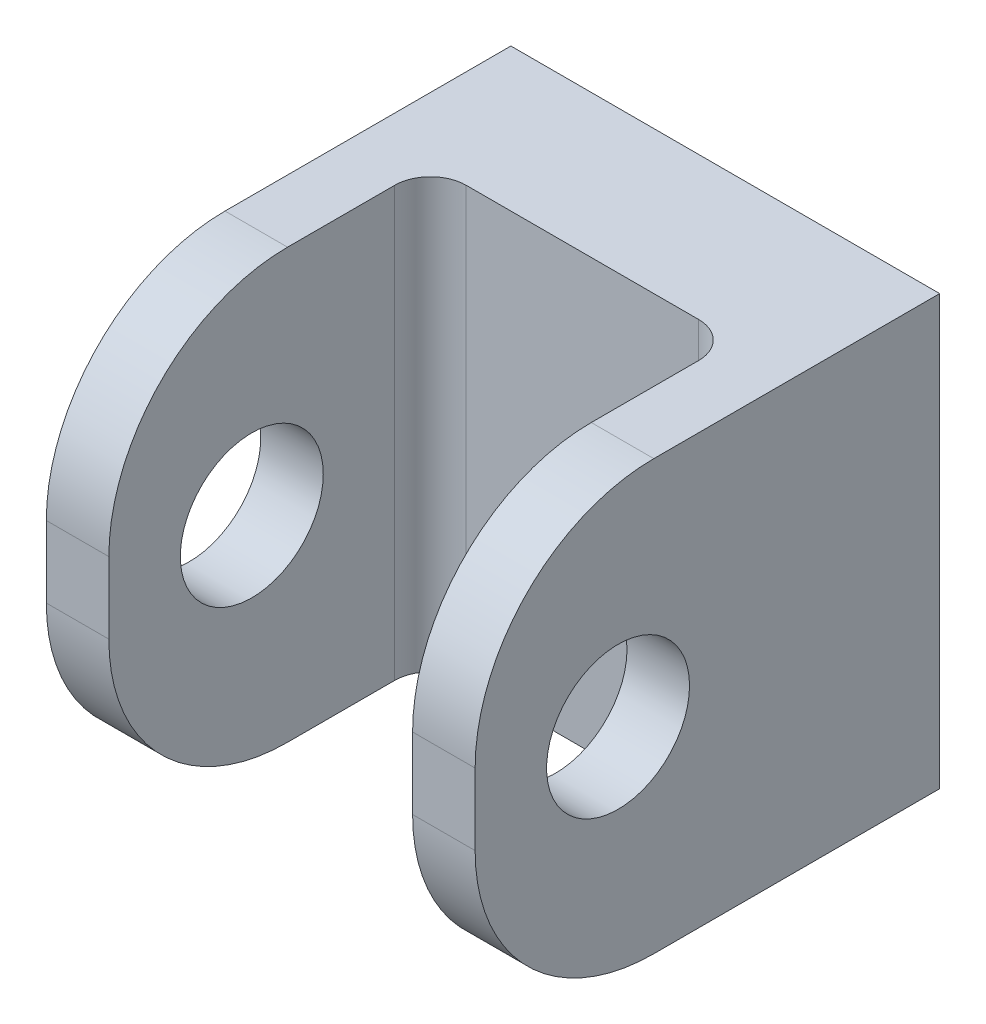
ISO-10303-21;
HEADER;
FILE_DESCRIPTION(('STEP AP214'),'2;1');
FILE_NAME('part.step','',(''),(''),'','','');
FILE_SCHEMA(('AUTOMOTIVE_DESIGN { 1 0 10303 214 1 1 1 1 }'));
ENDSEC;
DATA;
#1=APPLICATION_CONTEXT('core data for automotive mechanical design processes');
#2=APPLICATION_PROTOCOL_DEFINITION('international standard','automotive_design',2000,#1);
#3=PRODUCT_CONTEXT('',#1,'mechanical');
#4=PRODUCT('Part','Part','',(#3));
#5=PRODUCT_RELATED_PRODUCT_CATEGORY('part','',(#4));
#6=PRODUCT_DEFINITION_FORMATION('','',#4);
#7=PRODUCT_DEFINITION_CONTEXT('part definition',#1,'design');
#8=PRODUCT_DEFINITION('design','',#6,#7);
#9=PRODUCT_DEFINITION_SHAPE('','',#8);
#10=(LENGTH_UNIT() NAMED_UNIT(*) SI_UNIT(.MILLI.,.METRE.));
#11=(NAMED_UNIT(*) PLANE_ANGLE_UNIT() SI_UNIT($,.RADIAN.));
#12=(NAMED_UNIT(*) SI_UNIT($,.STERADIAN.) SOLID_ANGLE_UNIT());
#13=UNCERTAINTY_MEASURE_WITH_UNIT(LENGTH_MEASURE(1.E-05),#10,'distance_accuracy_value','');
#14=(GEOMETRIC_REPRESENTATION_CONTEXT(3) GLOBAL_UNCERTAINTY_ASSIGNED_CONTEXT((#13)) GLOBAL_UNIT_ASSIGNED_CONTEXT((#10,
#11,#12)) REPRESENTATION_CONTEXT('',''));
#15=CARTESIAN_POINT('',(0.,0.,0.));
#16=DIRECTION('',(0.,0.,1.));
#17=DIRECTION('',(1.,0.,0.));
#18=AXIS2_PLACEMENT_3D('',#15,#16,#17);
#19=CARTESIAN_POINT('',(0.,0.,-16.));
#20=DIRECTION('',(0.,0.,-1.));
#21=DIRECTION('',(-1.,0.,0.));
#22=AXIS2_PLACEMENT_3D('',#19,#20,#21);
#23=PLANE('',#22);
#24=DIRECTION('',(1.,0.,0.));
#25=VECTOR('',#24,1.);
#26=CARTESIAN_POINT('',(0.,-6.,-16.));
#27=LINE('',#26,#25);
#28=CARTESIAN_POINT('',(-3.25,-6.,-16.));
#29=VERTEX_POINT('',#28);
#30=CARTESIAN_POINT('',(3.25,-6.,-16.));
#31=VERTEX_POINT('',#30);
#32=EDGE_CURVE('E215',#29,#31,#27,.T.);
#33=ORIENTED_EDGE('',*,*,#32,.T.);
#34=DIRECTION('',(0.,-1.,0.));
#35=VECTOR('',#34,1.);
#36=CARTESIAN_POINT('',(3.25,6.,-16.));
#37=LINE('',#36,#35);
#38=CARTESIAN_POINT('',(3.25,6.,-16.));
#39=VERTEX_POINT('',#38);
#40=EDGE_CURVE('E249',#31,#39,#37,.F.);
#41=ORIENTED_EDGE('',*,*,#40,.T.);
#42=DIRECTION('',(-1.,0.,0.));
#43=VECTOR('',#42,1.);
#44=CARTESIAN_POINT('',(0.,6.,-16.));
#45=LINE('',#44,#43);
#46=CARTESIAN_POINT('',(-3.25,6.,-16.));
#47=VERTEX_POINT('',#46);
#48=EDGE_CURVE('E212',#39,#47,#45,.T.);
#49=ORIENTED_EDGE('',*,*,#48,.T.);
#50=DIRECTION('',(0.,-1.,0.));
#51=VECTOR('',#50,1.);
#52=CARTESIAN_POINT('',(-3.25,-6.,-16.));
#53=LINE('',#52,#51);
#54=EDGE_CURVE('E246',#47,#29,#53,.T.);
#55=ORIENTED_EDGE('',*,*,#54,.T.);
#56=EDGE_LOOP('',(#33,#41,#49,#55));
#57=FACE_BOUND('',#56,.T.);
#58=ADVANCED_FACE('F39',(#57),#23,.F.);
#59=CARTESIAN_POINT('',(6.,-6.,-16.));
#60=DIRECTION('',(-1.,0.,0.));
#61=DIRECTION('',(0.,0.,1.));
#62=AXIS2_PLACEMENT_3D('',#59,#60,#61);
#63=PLANE('',#62);
#64=CARTESIAN_POINT('',(6.,0.,-11.));
#65=DIRECTION('',(-1.,0.,0.));
#66=DIRECTION('',(0.,0.,1.));
#67=AXIS2_PLACEMENT_3D('',#64,#65,#66);
#68=CIRCLE('',#67,2.);
#69=CARTESIAN_POINT('',(6.,0.,-13.));
#70=VERTEX_POINT('',#69);
#71=EDGE_CURVE('E191',#70,#70,#68,.F.);
#72=ORIENTED_EDGE('',*,*,#71,.F.);
#73=EDGE_LOOP('',(#72));
#74=FACE_BOUND('',#73,.T.);
#75=DIRECTION('',(0.,1.,0.));
#76=VECTOR('',#75,1.);
#77=CARTESIAN_POINT('',(6.,-6.,-7.));
#78=LINE('',#77,#76);
#79=CARTESIAN_POINT('',(6.,-1.,-7.));
#80=VERTEX_POINT('',#79);
#81=CARTESIAN_POINT('',(6.,1.,-7.));
#82=VERTEX_POINT('',#81);
#83=EDGE_CURVE('E200',#80,#82,#78,.T.);
#84=ORIENTED_EDGE('',*,*,#83,.F.);
#85=CARTESIAN_POINT('',(6.,-1.,-12.));
#86=DIRECTION('',(-1.,0.,0.));
#87=DIRECTION('',(0.,0.,1.));
#88=AXIS2_PLACEMENT_3D('',#85,#86,#87);
#89=CIRCLE('',#88,5.);
#90=CARTESIAN_POINT('',(6.,-6.,-12.));
#91=VERTEX_POINT('',#90);
#92=EDGE_CURVE('E231',#80,#91,#89,.F.);
#93=ORIENTED_EDGE('',*,*,#92,.T.);
#94=DIRECTION('',(0.,0.,-1.));
#95=VECTOR('',#94,1.);
#96=CARTESIAN_POINT('',(6.,-6.,-16.));
#97=LINE('',#96,#95);
#98=CARTESIAN_POINT('',(6.,-6.,-20.));
#99=VERTEX_POINT('',#98);
#100=EDGE_CURVE('E218',#91,#99,#97,.T.);
#101=ORIENTED_EDGE('',*,*,#100,.T.);
#102=DIRECTION('',(0.,1.,0.));
#103=VECTOR('',#102,1.);
#104=CARTESIAN_POINT('',(6.,-6.,-20.));
#105=LINE('',#104,#103);
#106=CARTESIAN_POINT('',(6.,6.,-20.));
#107=VERTEX_POINT('',#106);
#108=EDGE_CURVE('E154',#99,#107,#105,.T.);
#109=ORIENTED_EDGE('',*,*,#108,.T.);
#110=DIRECTION('',(0.,0.,-1.));
#111=VECTOR('',#110,1.);
#112=CARTESIAN_POINT('',(6.,6.,-16.));
#113=LINE('',#112,#111);
#114=CARTESIAN_POINT('',(6.,6.,-12.));
#115=VERTEX_POINT('',#114);
#116=EDGE_CURVE('E149',#115,#107,#113,.T.);
#117=ORIENTED_EDGE('',*,*,#116,.F.);
#118=CARTESIAN_POINT('',(6.,1.,-12.));
#119=DIRECTION('',(-1.,0.,0.));
#120=DIRECTION('',(0.,0.,1.));
#121=AXIS2_PLACEMENT_3D('',#118,#119,#120);
#122=CIRCLE('',#121,5.);
#123=EDGE_CURVE('E229',#115,#82,#122,.F.);
#124=ORIENTED_EDGE('',*,*,#123,.T.);
#125=EDGE_LOOP('',(#84,#93,#101,#109,#117,#124));
#126=FACE_BOUND('',#125,.T.);
#127=ADVANCED_FACE('F312',(#74,#126),#63,.F.);
#128=CARTESIAN_POINT('',(0.,6.,-16.));
#129=DIRECTION('',(0.,-1.,0.));
#130=DIRECTION('',(0.,0.,-1.));
#131=AXIS2_PLACEMENT_3D('',#128,#129,#130);
#132=PLANE('',#131);
#133=DIRECTION('',(0.,0.,-1.));
#134=VECTOR('',#133,1.);
#135=CARTESIAN_POINT('',(4.25,6.,-7.));
#136=LINE('',#135,#134);
#137=CARTESIAN_POINT('',(4.25,6.,-12.));
#138=VERTEX_POINT('',#137);
#139=CARTESIAN_POINT('',(4.25,6.,-15.));
#140=VERTEX_POINT('',#139);
#141=EDGE_CURVE('E209',#138,#140,#136,.T.);
#142=ORIENTED_EDGE('',*,*,#141,.F.);
#143=DIRECTION('',(-1.,0.,0.));
#144=VECTOR('',#143,1.);
#145=CARTESIAN_POINT('',(6.,6.,-12.));
#146=LINE('',#145,#144);
#147=EDGE_CURVE('E239',#138,#115,#146,.F.);
#148=ORIENTED_EDGE('',*,*,#147,.T.);
#149=ORIENTED_EDGE('',*,*,#116,.T.);
#150=DIRECTION('',(-1.,0.,0.));
#151=VECTOR('',#150,1.);
#152=CARTESIAN_POINT('',(0.,6.,-20.));
#153=LINE('',#152,#151);
#154=CARTESIAN_POINT('',(-6.,6.,-20.));
#155=VERTEX_POINT('',#154);
#156=EDGE_CURVE('E140',#107,#155,#153,.T.);
#157=ORIENTED_EDGE('',*,*,#156,.T.);
#158=DIRECTION('',(0.,0.,-1.));
#159=VECTOR('',#158,1.);
#160=CARTESIAN_POINT('',(-6.,6.,-16.));
#161=LINE('',#160,#159);
#162=CARTESIAN_POINT('',(-6.,6.,-12.));
#163=VERTEX_POINT('',#162);
#164=EDGE_CURVE('E146',#163,#155,#161,.T.);
#165=ORIENTED_EDGE('',*,*,#164,.F.);
#166=DIRECTION('',(1.,0.,0.));
#167=VECTOR('',#166,1.);
#168=CARTESIAN_POINT('',(-6.,6.,-12.));
#169=LINE('',#168,#167);
#170=CARTESIAN_POINT('',(-4.25,6.,-12.));
#171=VERTEX_POINT('',#170);
#172=EDGE_CURVE('E189',#171,#163,#169,.F.);
#173=ORIENTED_EDGE('',*,*,#172,.F.);
#174=DIRECTION('',(0.,0.,-1.));
#175=VECTOR('',#174,1.);
#176=CARTESIAN_POINT('',(-4.25,6.,-7.));
#177=LINE('',#176,#175);
#178=CARTESIAN_POINT('',(-4.25,6.,-15.));
#179=VERTEX_POINT('',#178);
#180=EDGE_CURVE('E164',#171,#179,#177,.T.);
#181=ORIENTED_EDGE('',*,*,#180,.T.);
#182=CARTESIAN_POINT('',(-3.25,6.,-15.));
#183=DIRECTION('',(0.,-1.,0.));
#184=DIRECTION('',(0.,0.,-1.));
#185=AXIS2_PLACEMENT_3D('',#182,#183,#184);
#186=CIRCLE('',#185,1.);
#187=EDGE_CURVE('E11',#179,#47,#186,.T.);
#188=ORIENTED_EDGE('',*,*,#187,.T.);
#189=ORIENTED_EDGE('',*,*,#48,.F.);
#190=CARTESIAN_POINT('',(3.25,6.,-15.));
#191=DIRECTION('',(0.,-1.,0.));
#192=DIRECTION('',(0.,0.,-1.));
#193=AXIS2_PLACEMENT_3D('',#190,#191,#192);
#194=CIRCLE('',#193,1.);
#195=EDGE_CURVE('E254',#39,#140,#194,.T.);
#196=ORIENTED_EDGE('',*,*,#195,.T.);
#197=EDGE_LOOP('',(#142,#148,#149,#157,#165,#173,#181,#188,#189,#196));
#198=FACE_BOUND('',#197,.T.);
#199=ADVANCED_FACE('F143',(#198),#132,.F.);
#200=CARTESIAN_POINT('',(0.,-6.,-16.));
#201=DIRECTION('',(0.,1.,0.));
#202=DIRECTION('',(0.,0.,1.));
#203=AXIS2_PLACEMENT_3D('',#200,#201,#202);
#204=PLANE('',#203);
#205=ORIENTED_EDGE('',*,*,#100,.F.);
#206=DIRECTION('',(1.,0.,0.));
#207=VECTOR('',#206,1.);
#208=CARTESIAN_POINT('',(4.25,-6.,-12.));
#209=LINE('',#208,#207);
#210=CARTESIAN_POINT('',(4.25,-6.,-12.));
#211=VERTEX_POINT('',#210);
#212=EDGE_CURVE('E233',#91,#211,#209,.F.);
#213=ORIENTED_EDGE('',*,*,#212,.T.);
#214=DIRECTION('',(0.,0.,-1.));
#215=VECTOR('',#214,1.);
#216=CARTESIAN_POINT('',(4.25,-6.,-7.));
#217=LINE('',#216,#215);
#218=CARTESIAN_POINT('',(4.25,-6.,-15.));
#219=VERTEX_POINT('',#218);
#220=EDGE_CURVE('E206',#211,#219,#217,.T.);
#221=ORIENTED_EDGE('',*,*,#220,.T.);
#222=CARTESIAN_POINT('',(3.25,-6.,-15.));
#223=DIRECTION('',(0.,1.,0.));
#224=DIRECTION('',(0.,0.,1.));
#225=AXIS2_PLACEMENT_3D('',#222,#223,#224);
#226=CIRCLE('',#225,1.);
#227=EDGE_CURVE('E252',#219,#31,#226,.T.);
#228=ORIENTED_EDGE('',*,*,#227,.T.);
#229=ORIENTED_EDGE('',*,*,#32,.F.);
#230=CARTESIAN_POINT('',(-3.25,-6.,-15.));
#231=DIRECTION('',(0.,1.,0.));
#232=DIRECTION('',(0.,0.,1.));
#233=AXIS2_PLACEMENT_3D('',#230,#231,#232);
#234=CIRCLE('',#233,1.);
#235=CARTESIAN_POINT('',(-4.25,-6.,-15.));
#236=VERTEX_POINT('',#235);
#237=EDGE_CURVE('E47',#29,#236,#234,.T.);
#238=ORIENTED_EDGE('',*,*,#237,.T.);
#239=DIRECTION('',(0.,0.,-1.));
#240=VECTOR('',#239,1.);
#241=CARTESIAN_POINT('',(-4.25,-6.,-7.));
#242=LINE('',#241,#240);
#243=CARTESIAN_POINT('',(-4.25,-6.,-12.));
#244=VERTEX_POINT('',#243);
#245=EDGE_CURVE('E273',#244,#236,#242,.T.);
#246=ORIENTED_EDGE('',*,*,#245,.F.);
#247=DIRECTION('',(-1.,0.,0.));
#248=VECTOR('',#247,1.);
#249=CARTESIAN_POINT('',(-4.25,-6.,-12.));
#250=LINE('',#249,#248);
#251=CARTESIAN_POINT('',(-6.,-6.,-12.));
#252=VERTEX_POINT('',#251);
#253=EDGE_CURVE('E181',#252,#244,#250,.F.);
#254=ORIENTED_EDGE('',*,*,#253,.F.);
#255=DIRECTION('',(0.,0.,-1.));
#256=VECTOR('',#255,1.);
#257=CARTESIAN_POINT('',(-6.,-6.,-16.));
#258=LINE('',#257,#256);
#259=CARTESIAN_POINT('',(-6.,-6.,-20.));
#260=VERTEX_POINT('',#259);
#261=EDGE_CURVE('E163',#252,#260,#258,.T.);
#262=ORIENTED_EDGE('',*,*,#261,.T.);
#263=DIRECTION('',(1.,0.,0.));
#264=VECTOR('',#263,1.);
#265=CARTESIAN_POINT('',(0.,-6.,-20.));
#266=LINE('',#265,#264);
#267=EDGE_CURVE('E153',#260,#99,#266,.T.);
#268=ORIENTED_EDGE('',*,*,#267,.T.);
#269=EDGE_LOOP('',(#205,#213,#221,#228,#229,#238,#246,#254,#262,#268));
#270=FACE_BOUND('',#269,.T.);
#271=ADVANCED_FACE('F267',(#270),#204,.F.);
#272=CARTESIAN_POINT('',(0.,0.,-20.));
#273=DIRECTION('',(0.,0.,-1.));
#274=DIRECTION('',(-1.,0.,0.));
#275=AXIS2_PLACEMENT_3D('',#272,#273,#274);
#276=PLANE('',#275);
#277=ORIENTED_EDGE('',*,*,#108,.F.);
#278=ORIENTED_EDGE('',*,*,#267,.F.);
#279=DIRECTION('',(0.,1.,0.));
#280=VECTOR('',#279,1.);
#281=CARTESIAN_POINT('',(-6.,-6.,-20.));
#282=LINE('',#281,#280);
#283=EDGE_CURVE('E157',#260,#155,#282,.T.);
#284=ORIENTED_EDGE('',*,*,#283,.T.);
#285=ORIENTED_EDGE('',*,*,#156,.F.);
#286=EDGE_LOOP('',(#277,#278,#284,#285));
#287=FACE_BOUND('',#286,.T.);
#288=ADVANCED_FACE('F158',(#287),#276,.T.);
#289=CARTESIAN_POINT('',(4.25,-6.,-7.));
#290=DIRECTION('',(1.,0.,0.));
#291=DIRECTION('',(0.,0.,-1.));
#292=AXIS2_PLACEMENT_3D('',#289,#290,#291);
#293=PLANE('',#292);
#294=CARTESIAN_POINT('',(4.25,0.,-11.));
#295=DIRECTION('',(1.,0.,0.));
#296=DIRECTION('',(0.,0.,-1.));
#297=AXIS2_PLACEMENT_3D('',#294,#295,#296);
#298=CIRCLE('',#297,2.);
#299=CARTESIAN_POINT('',(4.25,0.,-13.));
#300=VERTEX_POINT('',#299);
#301=EDGE_CURVE('E199',#300,#300,#298,.F.);
#302=ORIENTED_EDGE('',*,*,#301,.F.);
#303=EDGE_LOOP('',(#302));
#304=FACE_BOUND('',#303,.T.);
#305=ORIENTED_EDGE('',*,*,#141,.T.);
#306=DIRECTION('',(0.,-1.,0.));
#307=VECTOR('',#306,1.);
#308=CARTESIAN_POINT('',(4.25,-6.,-15.));
#309=LINE('',#308,#307);
#310=EDGE_CURVE('E241',#140,#219,#309,.T.);
#311=ORIENTED_EDGE('',*,*,#310,.T.);
#312=ORIENTED_EDGE('',*,*,#220,.F.);
#313=CARTESIAN_POINT('',(4.25,-1.,-12.));
#314=DIRECTION('',(1.,0.,0.));
#315=DIRECTION('',(0.,0.,-1.));
#316=AXIS2_PLACEMENT_3D('',#313,#314,#315);
#317=CIRCLE('',#316,5.);
#318=CARTESIAN_POINT('',(4.25,-1.,-7.));
#319=VERTEX_POINT('',#318);
#320=EDGE_CURVE('E237',#211,#319,#317,.F.);
#321=ORIENTED_EDGE('',*,*,#320,.T.);
#322=DIRECTION('',(0.,-1.,0.));
#323=VECTOR('',#322,1.);
#324=CARTESIAN_POINT('',(4.25,-6.,-7.));
#325=LINE('',#324,#323);
#326=CARTESIAN_POINT('',(4.25,1.,-7.));
#327=VERTEX_POINT('',#326);
#328=EDGE_CURVE('E203',#327,#319,#325,.T.);
#329=ORIENTED_EDGE('',*,*,#328,.F.);
#330=CARTESIAN_POINT('',(4.25,1.,-12.));
#331=DIRECTION('',(1.,0.,0.));
#332=DIRECTION('',(0.,0.,-1.));
#333=AXIS2_PLACEMENT_3D('',#330,#331,#332);
#334=CIRCLE('',#333,5.);
#335=EDGE_CURVE('E235',#327,#138,#334,.F.);
#336=ORIENTED_EDGE('',*,*,#335,.T.);
#337=EDGE_LOOP('',(#305,#311,#312,#321,#329,#336));
#338=FACE_BOUND('',#337,.T.);
#339=ADVANCED_FACE('F262',(#304,#338),#293,.F.);
#340=CARTESIAN_POINT('',(0.,0.,-7.));
#341=DIRECTION('',(0.,0.,1.));
#342=DIRECTION('',(1.,0.,0.));
#343=AXIS2_PLACEMENT_3D('',#340,#341,#342);
#344=PLANE('',#343);
#345=ORIENTED_EDGE('',*,*,#328,.T.);
#346=DIRECTION('',(1.,0.,0.));
#347=VECTOR('',#346,1.);
#348=CARTESIAN_POINT('',(6.,-1.,-7.));
#349=LINE('',#348,#347);
#350=EDGE_CURVE('E226',#319,#80,#349,.T.);
#351=ORIENTED_EDGE('',*,*,#350,.T.);
#352=ORIENTED_EDGE('',*,*,#83,.T.);
#353=DIRECTION('',(-1.,0.,0.));
#354=VECTOR('',#353,1.);
#355=CARTESIAN_POINT('',(4.25,1.,-7.));
#356=LINE('',#355,#354);
#357=EDGE_CURVE('E223',#82,#327,#356,.T.);
#358=ORIENTED_EDGE('',*,*,#357,.T.);
#359=EDGE_LOOP('',(#345,#351,#352,#358));
#360=FACE_BOUND('',#359,.T.);
#361=ADVANCED_FACE('F334',(#360),#344,.T.);
#362=CARTESIAN_POINT('',(0.,-1.,-12.));
#363=DIRECTION('',(-1.,0.,0.));
#364=DIRECTION('',(0.,0.,1.));
#365=AXIS2_PLACEMENT_3D('',#362,#363,#364);
#366=CYLINDRICAL_SURFACE('',#365,5.);
#367=ORIENTED_EDGE('',*,*,#320,.F.);
#368=ORIENTED_EDGE('',*,*,#212,.F.);
#369=ORIENTED_EDGE('',*,*,#92,.F.);
#370=ORIENTED_EDGE('',*,*,#350,.F.);
#371=EDGE_LOOP('',(#367,#368,#369,#370));
#372=FACE_BOUND('',#371,.T.);
#373=ADVANCED_FACE('F330',(#372),#366,.T.);
#374=CARTESIAN_POINT('',(0.,1.,-12.));
#375=DIRECTION('',(1.,0.,0.));
#376=DIRECTION('',(0.,0.,-1.));
#377=AXIS2_PLACEMENT_3D('',#374,#375,#376);
#378=CYLINDRICAL_SURFACE('',#377,5.);
#379=ORIENTED_EDGE('',*,*,#123,.F.);
#380=ORIENTED_EDGE('',*,*,#147,.F.);
#381=ORIENTED_EDGE('',*,*,#335,.F.);
#382=ORIENTED_EDGE('',*,*,#357,.F.);
#383=EDGE_LOOP('',(#379,#380,#381,#382));
#384=FACE_BOUND('',#383,.T.);
#385=ADVANCED_FACE('F333',(#384),#378,.T.);
#386=CARTESIAN_POINT('',(-10.,0.,-11.));
#387=DIRECTION('',(1.,0.,0.));
#388=DIRECTION('',(0.,0.,-1.));
#389=AXIS2_PLACEMENT_3D('',#386,#387,#388);
#390=CYLINDRICAL_SURFACE('',#389,2.);
#391=CARTESIAN_POINT('',(6.,0.,-13.));
#392=CARTESIAN_POINT('',(5.98177083333334,0.,-13.));
#393=CARTESIAN_POINT('',(5.96354166666667,0.,-13.));
#394=CARTESIAN_POINT('',(5.92708333333334,0.,-13.));
#395=CARTESIAN_POINT('',(5.90885416666667,0.,-13.));
#396=CARTESIAN_POINT('',(5.87239583333334,0.,-13.));
#397=CARTESIAN_POINT('',(5.85416666666667,0.,-13.));
#398=CARTESIAN_POINT('',(5.81770833333334,0.,-13.));
#399=CARTESIAN_POINT('',(5.79947916666667,0.,-13.));
#400=CARTESIAN_POINT('',(5.76302083333334,0.,-13.));
#401=CARTESIAN_POINT('',(5.74479166666667,0.,-13.));
#402=CARTESIAN_POINT('',(5.70833333333333,0.,-13.));
#403=CARTESIAN_POINT('',(5.69010416666667,0.,-13.));
#404=CARTESIAN_POINT('',(5.65364583333334,0.,-13.));
#405=CARTESIAN_POINT('',(5.63541666666667,0.,-13.));
#406=CARTESIAN_POINT('',(5.59895833333334,0.,-13.));
#407=CARTESIAN_POINT('',(5.58072916666667,0.,-13.));
#408=CARTESIAN_POINT('',(5.54427083333334,0.,-13.));
#409=CARTESIAN_POINT('',(5.52604166666667,0.,-13.));
#410=CARTESIAN_POINT('',(5.48958333333334,0.,-13.));
#411=CARTESIAN_POINT('',(5.47135416666667,0.,-13.));
#412=CARTESIAN_POINT('',(5.43489583333334,0.,-13.));
#413=CARTESIAN_POINT('',(5.41666666666667,0.,-13.));
#414=CARTESIAN_POINT('',(5.38020833333334,0.,-13.));
#415=CARTESIAN_POINT('',(5.36197916666667,0.,-13.));
#416=CARTESIAN_POINT('',(5.32552083333334,0.,-13.));
#417=CARTESIAN_POINT('',(5.30729166666667,0.,-13.));
#418=CARTESIAN_POINT('',(5.27083333333334,0.,-13.));
#419=CARTESIAN_POINT('',(5.25260416666667,0.,-13.));
#420=CARTESIAN_POINT('',(5.21614583333334,0.,-13.));
#421=CARTESIAN_POINT('',(5.19791666666667,0.,-13.));
#422=CARTESIAN_POINT('',(5.16145833333334,0.,-13.));
#423=CARTESIAN_POINT('',(5.14322916666667,0.,-13.));
#424=CARTESIAN_POINT('',(5.10677083333334,0.,-13.));
#425=CARTESIAN_POINT('',(5.08854166666667,0.,-13.));
#426=CARTESIAN_POINT('',(5.05208333333334,0.,-13.));
#427=CARTESIAN_POINT('',(5.03385416666667,0.,-13.));
#428=CARTESIAN_POINT('',(4.99739583333334,0.,-13.));
#429=CARTESIAN_POINT('',(4.97916666666667,0.,-13.));
#430=CARTESIAN_POINT('',(4.94270833333334,0.,-13.));
#431=CARTESIAN_POINT('',(4.92447916666667,0.,-13.));
#432=CARTESIAN_POINT('',(4.88802083333334,0.,-13.));
#433=CARTESIAN_POINT('',(4.86979166666667,0.,-13.));
#434=CARTESIAN_POINT('',(4.83333333333334,0.,-13.));
#435=CARTESIAN_POINT('',(4.81510416666667,0.,-13.));
#436=CARTESIAN_POINT('',(4.77864583333334,0.,-13.));
#437=CARTESIAN_POINT('',(4.76041666666667,0.,-13.));
#438=CARTESIAN_POINT('',(4.72395833333333,0.,-13.));
#439=CARTESIAN_POINT('',(4.70572916666667,0.,-13.));
#440=CARTESIAN_POINT('',(4.66927083333333,0.,-13.));
#441=CARTESIAN_POINT('',(4.65104166666667,0.,-13.));
#442=CARTESIAN_POINT('',(4.61458333333333,0.,-13.));
#443=CARTESIAN_POINT('',(4.59635416666667,0.,-13.));
#444=CARTESIAN_POINT('',(4.55989583333333,0.,-13.));
#445=CARTESIAN_POINT('',(4.54166666666667,0.,-13.));
#446=CARTESIAN_POINT('',(4.50520833333333,0.,-13.));
#447=CARTESIAN_POINT('',(4.48697916666667,0.,-13.));
#448=CARTESIAN_POINT('',(4.45052083333333,0.,-13.));
#449=CARTESIAN_POINT('',(4.43229166666667,0.,-13.));
#450=CARTESIAN_POINT('',(4.39583333333333,0.,-13.));
#451=CARTESIAN_POINT('',(4.37760416666667,0.,-13.));
#452=CARTESIAN_POINT('',(4.34114583333333,0.,-13.));
#453=CARTESIAN_POINT('',(4.32291666666667,0.,-13.));
#454=CARTESIAN_POINT('',(4.28645833333333,0.,-13.));
#455=CARTESIAN_POINT('',(4.26822916666667,0.,-13.));
#456=CARTESIAN_POINT('',(4.25,0.,-13.));
#457=B_SPLINE_CURVE_WITH_KNOTS('',3,(#391,#392,#393,#394,#395,#396,#397,#398,#399,#400,#401,
#402,#403,#404,#405,#406,#407,#408,#409,#410,#411,#412,#413,#414,#415,#416,#417,#418,#419,#420,
#421,#422,#423,#424,#425,#426,#427,#428,#429,#430,#431,#432,#433,#434,#435,#436,#437,#438,#439,
#440,#441,#442,#443,#444,#445,#446,#447,#448,#449,#450,#451,#452,#453,#454,#455,#456),
.UNSPECIFIED.,.F.,.F.,(4,2,2,2,2,2,2,2,2,2,2,2,2,2,2,2,2,2,2,2,2,2,2,2,2,2,2,2,2,2,2,2,4),(0.,
0.0546875000000009,0.109375000000002,0.164062499999999,0.21875,0.273437500000001,
0.328125000000002,0.382812499999999,0.437499999999999,0.4921875,0.546875,0.6015625,
0.656250000000001,0.7109375,0.765625000000001,0.8203125,0.875000000000001,0.929687500000002,
0.984375000000001,1.0390625,1.09375,1.1484375,1.203125,1.2578125,1.3125,1.3671875,1.421875,
1.4765625,1.53125,1.5859375,1.640625,1.6953125,1.75),.UNSPECIFIED.);
#458=EDGE_CURVE('BSEAM337',#70,#300,#457,.T.);
#459=ORIENTED_EDGE('',*,*,#71,.T.);
#460=ORIENTED_EDGE('',*,*,#301,.T.);
#461=ORIENTED_EDGE('',*,*,#458,.T.);
#462=ORIENTED_EDGE('',*,*,#458,.F.);
#463=EDGE_LOOP('',(#459,#461,#460,#462));
#464=FACE_BOUND('',#463,.T.);
#465=ADVANCED_FACE('F337',(#464),#390,.F.);
#466=CARTESIAN_POINT('',(-6.,-6.,-16.));
#467=DIRECTION('',(1.,0.,0.));
#468=DIRECTION('',(0.,0.,1.));
#469=AXIS2_PLACEMENT_3D('',#466,#467,#468);
#470=PLANE('',#469);
#471=CARTESIAN_POINT('',(-6.,0.,-11.));
#472=DIRECTION('',(-1.,0.,0.));
#473=DIRECTION('',(0.,0.,1.));
#474=AXIS2_PLACEMENT_3D('',#471,#472,#473);
#475=CIRCLE('',#474,2.);
#476=CARTESIAN_POINT('',(-6.,0.,-13.));
#477=VERTEX_POINT('',#476);
#478=EDGE_CURVE('E196',#477,#477,#475,.F.);
#479=ORIENTED_EDGE('',*,*,#478,.T.);
#480=EDGE_LOOP('',(#479));
#481=FACE_BOUND('',#480,.T.);
#482=DIRECTION('',(0.,1.,0.));
#483=VECTOR('',#482,1.);
#484=CARTESIAN_POINT('',(-6.,-6.,-7.));
#485=LINE('',#484,#483);
#486=CARTESIAN_POINT('',(-6.,-1.,-7.));
#487=VERTEX_POINT('',#486);
#488=CARTESIAN_POINT('',(-6.,1.,-7.));
#489=VERTEX_POINT('',#488);
#490=EDGE_CURVE('E195',#487,#489,#485,.T.);
#491=ORIENTED_EDGE('',*,*,#490,.T.);
#492=CARTESIAN_POINT('',(-6.,1.,-12.));
#493=DIRECTION('',(-1.,0.,0.));
#494=DIRECTION('',(0.,0.,1.));
#495=AXIS2_PLACEMENT_3D('',#492,#493,#494);
#496=CIRCLE('',#495,5.);
#497=EDGE_CURVE('E169',#163,#489,#496,.F.);
#498=ORIENTED_EDGE('',*,*,#497,.F.);
#499=ORIENTED_EDGE('',*,*,#164,.T.);
#500=ORIENTED_EDGE('',*,*,#283,.F.);
#501=ORIENTED_EDGE('',*,*,#261,.F.);
#502=CARTESIAN_POINT('',(-6.,-1.,-12.));
#503=DIRECTION('',(-1.,0.,0.));
#504=DIRECTION('',(0.,0.,1.));
#505=AXIS2_PLACEMENT_3D('',#502,#503,#504);
#506=CIRCLE('',#505,5.);
#507=EDGE_CURVE('E178',#487,#252,#506,.F.);
#508=ORIENTED_EDGE('',*,*,#507,.F.);
#509=EDGE_LOOP('',(#491,#498,#499,#500,#501,#508));
#510=FACE_BOUND('',#509,.T.);
#511=ADVANCED_FACE('F167',(#481,#510),#470,.F.);
#512=CARTESIAN_POINT('',(-4.25,-6.,-7.));
#513=DIRECTION('',(-1.,0.,0.));
#514=DIRECTION('',(0.,0.,-1.));
#515=AXIS2_PLACEMENT_3D('',#512,#513,#514);
#516=PLANE('',#515);
#517=CARTESIAN_POINT('',(-4.25,0.,-11.));
#518=DIRECTION('',(1.,0.,0.));
#519=DIRECTION('',(0.,0.,-1.));
#520=AXIS2_PLACEMENT_3D('',#517,#518,#519);
#521=CIRCLE('',#520,2.);
#522=CARTESIAN_POINT('',(-4.25,0.,-13.));
#523=VERTEX_POINT('',#522);
#524=EDGE_CURVE('E192',#523,#523,#521,.F.);
#525=ORIENTED_EDGE('',*,*,#524,.T.);
#526=EDGE_LOOP('',(#525));
#527=FACE_BOUND('',#526,.T.);
#528=ORIENTED_EDGE('',*,*,#245,.T.);
#529=DIRECTION('',(0.,-1.,0.));
#530=VECTOR('',#529,1.);
#531=CARTESIAN_POINT('',(-4.25,6.,-15.));
#532=LINE('',#531,#530);
#533=EDGE_CURVE('E54',#236,#179,#532,.F.);
#534=ORIENTED_EDGE('',*,*,#533,.T.);
#535=ORIENTED_EDGE('',*,*,#180,.F.);
#536=CARTESIAN_POINT('',(-4.25,1.,-12.));
#537=DIRECTION('',(1.,0.,0.));
#538=DIRECTION('',(0.,0.,-1.));
#539=AXIS2_PLACEMENT_3D('',#536,#537,#538);
#540=CIRCLE('',#539,5.);
#541=CARTESIAN_POINT('',(-4.25,1.,-7.));
#542=VERTEX_POINT('',#541);
#543=EDGE_CURVE('E184',#542,#171,#540,.F.);
#544=ORIENTED_EDGE('',*,*,#543,.F.);
#545=DIRECTION('',(0.,-1.,0.));
#546=VECTOR('',#545,1.);
#547=CARTESIAN_POINT('',(-4.25,-6.,-7.));
#548=LINE('',#547,#546);
#549=CARTESIAN_POINT('',(-4.25,-1.,-7.));
#550=VERTEX_POINT('',#549);
#551=EDGE_CURVE('E275',#542,#550,#548,.T.);
#552=ORIENTED_EDGE('',*,*,#551,.T.);
#553=CARTESIAN_POINT('',(-4.25,-1.,-12.));
#554=DIRECTION('',(1.,0.,0.));
#555=DIRECTION('',(0.,0.,-1.));
#556=AXIS2_PLACEMENT_3D('',#553,#554,#555);
#557=CIRCLE('',#556,5.);
#558=EDGE_CURVE('E186',#244,#550,#557,.F.);
#559=ORIENTED_EDGE('',*,*,#558,.F.);
#560=EDGE_LOOP('',(#528,#534,#535,#544,#552,#559));
#561=FACE_BOUND('',#560,.T.);
#562=ADVANCED_FACE('F292',(#527,#561),#516,.F.);
#563=CARTESIAN_POINT('',(0.,0.,-7.));
#564=DIRECTION('',(0.,0.,1.));
#565=DIRECTION('',(-1.,0.,0.));
#566=AXIS2_PLACEMENT_3D('',#563,#564,#565);
#567=PLANE('',#566);
#568=ORIENTED_EDGE('',*,*,#551,.F.);
#569=DIRECTION('',(1.,0.,0.));
#570=VECTOR('',#569,1.);
#571=CARTESIAN_POINT('',(-4.25,1.,-7.));
#572=LINE('',#571,#570);
#573=EDGE_CURVE('E170',#489,#542,#572,.T.);
#574=ORIENTED_EDGE('',*,*,#573,.F.);
#575=ORIENTED_EDGE('',*,*,#490,.F.);
#576=DIRECTION('',(-1.,0.,0.));
#577=VECTOR('',#576,1.);
#578=CARTESIAN_POINT('',(-6.,-1.,-7.));
#579=LINE('',#578,#577);
#580=EDGE_CURVE('E172',#550,#487,#579,.T.);
#581=ORIENTED_EDGE('',*,*,#580,.F.);
#582=EDGE_LOOP('',(#568,#574,#575,#581));
#583=FACE_BOUND('',#582,.T.);
#584=ADVANCED_FACE('F294',(#583),#567,.T.);
#585=CARTESIAN_POINT('',(0.,-1.,-12.));
#586=DIRECTION('',(1.,0.,0.));
#587=DIRECTION('',(0.,0.,1.));
#588=AXIS2_PLACEMENT_3D('',#585,#586,#587);
#589=CYLINDRICAL_SURFACE('',#588,5.);
#590=ORIENTED_EDGE('',*,*,#558,.T.);
#591=ORIENTED_EDGE('',*,*,#580,.T.);
#592=ORIENTED_EDGE('',*,*,#507,.T.);
#593=ORIENTED_EDGE('',*,*,#253,.T.);
#594=EDGE_LOOP('',(#590,#591,#592,#593));
#595=FACE_BOUND('',#594,.T.);
#596=ADVANCED_FACE('F298',(#595),#589,.T.);
#597=CARTESIAN_POINT('',(0.,1.,-12.));
#598=DIRECTION('',(-1.,0.,0.));
#599=DIRECTION('',(0.,0.,-1.));
#600=AXIS2_PLACEMENT_3D('',#597,#598,#599);
#601=CYLINDRICAL_SURFACE('',#600,5.);
#602=ORIENTED_EDGE('',*,*,#497,.T.);
#603=ORIENTED_EDGE('',*,*,#573,.T.);
#604=ORIENTED_EDGE('',*,*,#543,.T.);
#605=ORIENTED_EDGE('',*,*,#172,.T.);
#606=EDGE_LOOP('',(#602,#603,#604,#605));
#607=FACE_BOUND('',#606,.T.);
#608=ADVANCED_FACE('F288',(#607),#601,.T.);
#609=CARTESIAN_POINT('',(10.,0.,-11.));
#610=DIRECTION('',(-1.,0.,0.));
#611=DIRECTION('',(0.,0.,-1.));
#612=AXIS2_PLACEMENT_3D('',#609,#610,#611);
#613=CYLINDRICAL_SURFACE('',#612,2.);
#614=CARTESIAN_POINT('',(-6.,0.,-13.));
#615=CARTESIAN_POINT('',(-5.98177083333333,0.,-13.));
#616=CARTESIAN_POINT('',(-5.96354166666666,0.,-13.));
#617=CARTESIAN_POINT('',(-5.92708333333333,0.,-13.));
#618=CARTESIAN_POINT('',(-5.90885416666666,0.,-13.));
#619=CARTESIAN_POINT('',(-5.87239583333333,0.,-13.));
#620=CARTESIAN_POINT('',(-5.85416666666666,0.,-13.));
#621=CARTESIAN_POINT('',(-5.81770833333333,0.,-13.));
#622=CARTESIAN_POINT('',(-5.79947916666666,0.,-13.));
#623=CARTESIAN_POINT('',(-5.76302083333333,0.,-13.));
#624=CARTESIAN_POINT('',(-5.74479166666666,0.,-13.));
#625=CARTESIAN_POINT('',(-5.70833333333333,0.,-13.));
#626=CARTESIAN_POINT('',(-5.69010416666666,0.,-13.));
#627=CARTESIAN_POINT('',(-5.65364583333333,0.,-13.));
#628=CARTESIAN_POINT('',(-5.63541666666667,0.,-13.));
#629=CARTESIAN_POINT('',(-5.59895833333333,0.,-13.));
#630=CARTESIAN_POINT('',(-5.58072916666667,0.,-13.));
#631=CARTESIAN_POINT('',(-5.54427083333333,0.,-13.));
#632=CARTESIAN_POINT('',(-5.52604166666667,0.,-13.));
#633=CARTESIAN_POINT('',(-5.48958333333333,0.,-13.));
#634=CARTESIAN_POINT('',(-5.47135416666667,0.,-13.));
#635=CARTESIAN_POINT('',(-5.43489583333333,0.,-13.));
#636=CARTESIAN_POINT('',(-5.41666666666667,0.,-13.));
#637=CARTESIAN_POINT('',(-5.38020833333333,0.,-13.));
#638=CARTESIAN_POINT('',(-5.36197916666667,0.,-13.));
#639=CARTESIAN_POINT('',(-5.32552083333333,0.,-13.));
#640=CARTESIAN_POINT('',(-5.30729166666667,0.,-13.));
#641=CARTESIAN_POINT('',(-5.27083333333333,0.,-13.));
#642=CARTESIAN_POINT('',(-5.25260416666667,0.,-13.));
#643=CARTESIAN_POINT('',(-5.21614583333333,0.,-13.));
#644=CARTESIAN_POINT('',(-5.19791666666667,0.,-13.));
#645=CARTESIAN_POINT('',(-5.16145833333333,0.,-13.));
#646=CARTESIAN_POINT('',(-5.14322916666667,0.,-13.));
#647=CARTESIAN_POINT('',(-5.10677083333333,0.,-13.));
#648=CARTESIAN_POINT('',(-5.08854166666667,0.,-13.));
#649=CARTESIAN_POINT('',(-5.05208333333333,0.,-13.));
#650=CARTESIAN_POINT('',(-5.03385416666667,0.,-13.));
#651=CARTESIAN_POINT('',(-4.99739583333333,0.,-13.));
#652=CARTESIAN_POINT('',(-4.97916666666667,0.,-13.));
#653=CARTESIAN_POINT('',(-4.94270833333333,0.,-13.));
#654=CARTESIAN_POINT('',(-4.92447916666667,0.,-13.));
#655=CARTESIAN_POINT('',(-4.88802083333333,0.,-13.));
#656=CARTESIAN_POINT('',(-4.86979166666667,0.,-13.));
#657=CARTESIAN_POINT('',(-4.83333333333333,0.,-13.));
#658=CARTESIAN_POINT('',(-4.81510416666667,0.,-13.));
#659=CARTESIAN_POINT('',(-4.77864583333333,0.,-13.));
#660=CARTESIAN_POINT('',(-4.76041666666667,0.,-13.));
#661=CARTESIAN_POINT('',(-4.72395833333333,0.,-13.));
#662=CARTESIAN_POINT('',(-4.70572916666667,0.,-13.));
#663=CARTESIAN_POINT('',(-4.66927083333333,0.,-13.));
#664=CARTESIAN_POINT('',(-4.65104166666667,0.,-13.));
#665=CARTESIAN_POINT('',(-4.61458333333333,0.,-13.));
#666=CARTESIAN_POINT('',(-4.59635416666667,0.,-13.));
#667=CARTESIAN_POINT('',(-4.55989583333333,0.,-13.));
#668=CARTESIAN_POINT('',(-4.54166666666667,0.,-13.));
#669=CARTESIAN_POINT('',(-4.50520833333333,0.,-13.));
#670=CARTESIAN_POINT('',(-4.48697916666667,0.,-13.));
#671=CARTESIAN_POINT('',(-4.45052083333333,0.,-13.));
#672=CARTESIAN_POINT('',(-4.43229166666667,0.,-13.));
#673=CARTESIAN_POINT('',(-4.39583333333333,0.,-13.));
#674=CARTESIAN_POINT('',(-4.37760416666667,0.,-13.));
#675=CARTESIAN_POINT('',(-4.34114583333333,0.,-13.));
#676=CARTESIAN_POINT('',(-4.32291666666667,0.,-13.));
#677=CARTESIAN_POINT('',(-4.28645833333333,0.,-13.));
#678=CARTESIAN_POINT('',(-4.26822916666667,0.,-13.));
#679=CARTESIAN_POINT('',(-4.25,0.,-13.));
#680=B_SPLINE_CURVE_WITH_KNOTS('',3,(#614,#615,#616,#617,#618,#619,#620,#621,#622,#623,#624,
#625,#626,#627,#628,#629,#630,#631,#632,#633,#634,#635,#636,#637,#638,#639,#640,#641,#642,#643,
#644,#645,#646,#647,#648,#649,#650,#651,#652,#653,#654,#655,#656,#657,#658,#659,#660,#661,#662,
#663,#664,#665,#666,#667,#668,#669,#670,#671,#672,#673,#674,#675,#676,#677,#678,#679),
.UNSPECIFIED.,.F.,.F.,(4,2,2,2,2,2,2,2,2,2,2,2,2,2,2,2,2,2,2,2,2,2,2,2,2,2,2,2,2,2,2,2,4),(0.,
0.0546875000000009,0.109374999999998,0.164062499999999,0.21875,0.273437500000001,
0.328124999999999,0.382812499999998,0.437499999999999,0.492187499999998,0.546874999999997,
0.601562499999998,0.656249999999997,0.710937499999998,0.765624999999997,0.820312499999998,
0.874999999999997,0.929687499999996,0.984374999999997,1.0390625,1.09375,1.1484375,1.203125,
1.2578125,1.3125,1.3671875,1.421875,1.4765625,1.53125,1.5859375,1.640625,1.6953125,1.75),.UNSPECIFIED.);
#681=EDGE_CURVE('BSEAM285',#477,#523,#680,.T.);
#682=ORIENTED_EDGE('',*,*,#478,.F.);
#683=ORIENTED_EDGE('',*,*,#524,.F.);
#684=ORIENTED_EDGE('',*,*,#681,.T.);
#685=ORIENTED_EDGE('',*,*,#681,.F.);
#686=EDGE_LOOP('',(#682,#684,#683,#685));
#687=FACE_BOUND('',#686,.T.);
#688=ADVANCED_FACE('F285',(#687),#613,.F.);
#689=CARTESIAN_POINT('',(3.25,-6.,-15.));
#690=DIRECTION('',(0.,1.,0.));
#691=DIRECTION('',(0.,0.,1.));
#692=AXIS2_PLACEMENT_3D('',#689,#690,#691);
#693=CYLINDRICAL_SURFACE('',#692,1.);
#694=ORIENTED_EDGE('',*,*,#195,.F.);
#695=ORIENTED_EDGE('',*,*,#40,.F.);
#696=ORIENTED_EDGE('',*,*,#227,.F.);
#697=ORIENTED_EDGE('',*,*,#310,.F.);
#698=EDGE_LOOP('',(#694,#695,#696,#697));
#699=FACE_BOUND('',#698,.T.);
#700=ADVANCED_FACE('F265',(#699),#693,.F.);
#701=CARTESIAN_POINT('',(-3.25,0.,-15.));
#702=DIRECTION('',(0.,1.,0.));
#703=DIRECTION('',(0.,0.,1.));
#704=AXIS2_PLACEMENT_3D('',#701,#702,#703);
#705=CYLINDRICAL_SURFACE('',#704,1.);
#706=ORIENTED_EDGE('',*,*,#187,.F.);
#707=ORIENTED_EDGE('',*,*,#533,.F.);
#708=ORIENTED_EDGE('',*,*,#237,.F.);
#709=ORIENTED_EDGE('',*,*,#54,.F.);
#710=EDGE_LOOP('',(#706,#707,#708,#709));
#711=FACE_BOUND('',#710,.T.);
#712=ADVANCED_FACE('F41',(#711),#705,.F.);
#713=CLOSED_SHELL('',(#58,#127,#199,#271,#288,#339,#361,#373,#385,#465,#511,#562,#584,#596,#608,
#688,#700,#712));
#714=MANIFOLD_SOLID_BREP('B2',#713);
#715=ADVANCED_BREP_SHAPE_REPRESENTATION('',(#18,#714),#14);
#716=SHAPE_DEFINITION_REPRESENTATION(#9,#715);
ENDSEC;
END-ISO-10303-21;
